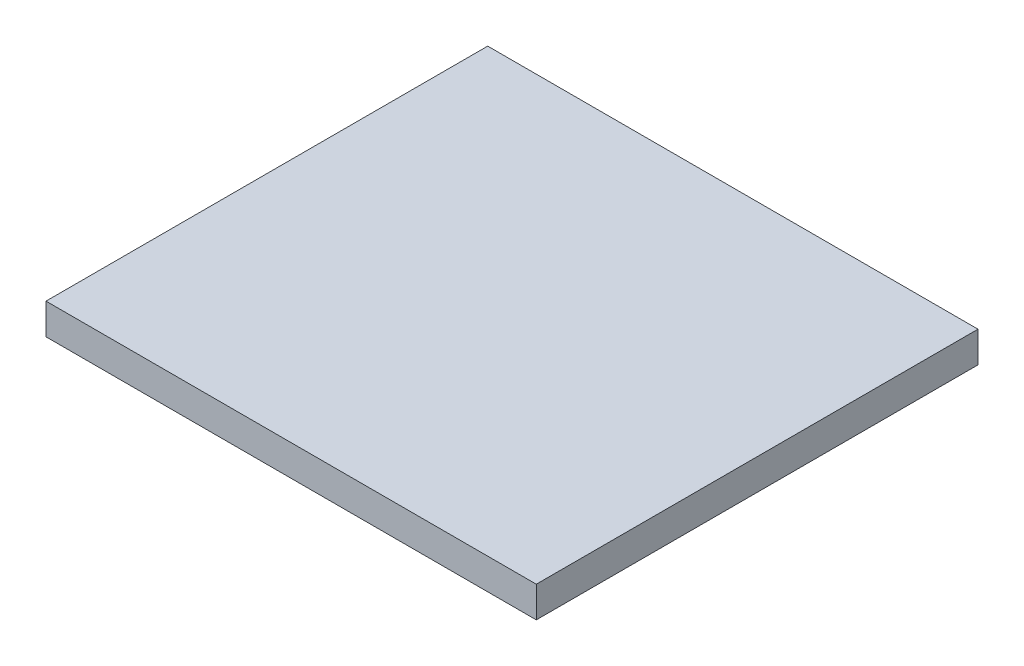
ISO-10303-21;
HEADER;
FILE_DESCRIPTION(('STEP AP214'),'2;1');
FILE_NAME('part.step','',(''),(''),'','','');
FILE_SCHEMA(('AUTOMOTIVE_DESIGN { 1 0 10303 214 1 1 1 1 }'));
ENDSEC;
DATA;
#1=APPLICATION_CONTEXT('core data for automotive mechanical design processes');
#2=APPLICATION_PROTOCOL_DEFINITION('international standard','automotive_design',2000,#1);
#3=PRODUCT_CONTEXT('',#1,'mechanical');
#4=PRODUCT('Part','Part','',(#3));
#5=PRODUCT_RELATED_PRODUCT_CATEGORY('part','',(#4));
#6=PRODUCT_DEFINITION_FORMATION('','',#4);
#7=PRODUCT_DEFINITION_CONTEXT('part definition',#1,'design');
#8=PRODUCT_DEFINITION('design','',#6,#7);
#9=PRODUCT_DEFINITION_SHAPE('','',#8);
#10=(LENGTH_UNIT() NAMED_UNIT(*) SI_UNIT(.MILLI.,.METRE.));
#11=(NAMED_UNIT(*) PLANE_ANGLE_UNIT() SI_UNIT($,.RADIAN.));
#12=(NAMED_UNIT(*) SI_UNIT($,.STERADIAN.) SOLID_ANGLE_UNIT());
#13=UNCERTAINTY_MEASURE_WITH_UNIT(LENGTH_MEASURE(1.E-05),#10,'distance_accuracy_value','');
#14=(GEOMETRIC_REPRESENTATION_CONTEXT(3) GLOBAL_UNCERTAINTY_ASSIGNED_CONTEXT((#13)) GLOBAL_UNIT_ASSIGNED_CONTEXT((#10,
#11,#12)) REPRESENTATION_CONTEXT('',''));
#15=CARTESIAN_POINT('',(0.,0.,0.));
#16=DIRECTION('',(0.,0.,1.));
#17=DIRECTION('',(1.,0.,0.));
#18=AXIS2_PLACEMENT_3D('',#15,#16,#17);
#19=CARTESIAN_POINT('',(-80.9756097560976,7.,-49.0243902439025));
#20=DIRECTION('',(1.,0.,0.));
#21=DIRECTION('',(0.,0.,-1.));
#22=AXIS2_PLACEMENT_3D('',#19,#20,#21);
#23=PLANE('',#22);
#24=DIRECTION('',(0.,0.,1.));
#25=VECTOR('',#24,1.);
#26=CARTESIAN_POINT('',(-80.9756097560976,0.,-49.0243902439025));
#27=LINE('',#26,#25);
#28=CARTESIAN_POINT('',(-80.9756097560976,0.,-49.0243902439025));
#29=VERTEX_POINT('',#28);
#30=CARTESIAN_POINT('',(-80.9756097560976,0.,50.9756097560975));
#31=VERTEX_POINT('',#30);
#32=EDGE_CURVE('E96',#29,#31,#27,.T.);
#33=ORIENTED_EDGE('',*,*,#32,.T.);
#34=DIRECTION('',(0.,-1.,0.));
#35=VECTOR('',#34,1.);
#36=CARTESIAN_POINT('',(-80.9756097560976,7.,50.9756097560975));
#37=LINE('',#36,#35);
#38=CARTESIAN_POINT('',(-80.9756097560976,7.,50.9756097560975));
#39=VERTEX_POINT('',#38);
#40=EDGE_CURVE('E11',#39,#31,#37,.T.);
#41=ORIENTED_EDGE('',*,*,#40,.F.);
#42=DIRECTION('',(0.,0.,1.));
#43=VECTOR('',#42,1.);
#44=CARTESIAN_POINT('',(-80.9756097560976,7.,-49.0243902439025));
#45=LINE('',#44,#43);
#46=CARTESIAN_POINT('',(-80.9756097560976,7.,-49.0243902439025));
#47=VERTEX_POINT('',#46);
#48=EDGE_CURVE('E84',#47,#39,#45,.T.);
#49=ORIENTED_EDGE('',*,*,#48,.F.);
#50=DIRECTION('',(0.,-1.,0.));
#51=VECTOR('',#50,1.);
#52=CARTESIAN_POINT('',(-80.9756097560976,7.,-49.0243902439025));
#53=LINE('',#52,#51);
#54=EDGE_CURVE('E92',#47,#29,#53,.T.);
#55=ORIENTED_EDGE('',*,*,#54,.T.);
#56=EDGE_LOOP('',(#33,#41,#49,#55));
#57=FACE_BOUND('',#56,.T.);
#58=ADVANCED_FACE('F33',(#57),#23,.F.);
#59=CARTESIAN_POINT('',(-80.9756097560976,7.,50.9756097560975));
#60=DIRECTION('',(0.,0.,-1.));
#61=DIRECTION('',(-1.,0.,0.));
#62=AXIS2_PLACEMENT_3D('',#59,#60,#61);
#63=PLANE('',#62);
#64=DIRECTION('',(1.,0.,0.));
#65=VECTOR('',#64,1.);
#66=CARTESIAN_POINT('',(-80.9756097560976,0.,50.9756097560975));
#67=LINE('',#66,#65);
#68=CARTESIAN_POINT('',(30.0243902439024,0.,50.9756097560975));
#69=VERTEX_POINT('',#68);
#70=EDGE_CURVE('E88',#31,#69,#67,.T.);
#71=ORIENTED_EDGE('',*,*,#70,.T.);
#72=DIRECTION('',(0.,-1.,0.));
#73=VECTOR('',#72,1.);
#74=CARTESIAN_POINT('',(30.0243902439024,7.,50.9756097560975));
#75=LINE('',#74,#73);
#76=CARTESIAN_POINT('',(30.0243902439024,7.,50.9756097560975));
#77=VERTEX_POINT('',#76);
#78=EDGE_CURVE('E41',#77,#69,#75,.T.);
#79=ORIENTED_EDGE('',*,*,#78,.F.);
#80=DIRECTION('',(1.,0.,0.));
#81=VECTOR('',#80,1.);
#82=CARTESIAN_POINT('',(-80.9756097560976,7.,50.9756097560975));
#83=LINE('',#82,#81);
#84=EDGE_CURVE('E79',#39,#77,#83,.T.);
#85=ORIENTED_EDGE('',*,*,#84,.F.);
#86=ORIENTED_EDGE('',*,*,#40,.T.);
#87=EDGE_LOOP('',(#71,#79,#85,#86));
#88=FACE_BOUND('',#87,.T.);
#89=ADVANCED_FACE('F87',(#88),#63,.F.);
#90=CARTESIAN_POINT('',(30.0243902439024,7.,-49.0243902439025));
#91=DIRECTION('',(-1.,0.,0.));
#92=DIRECTION('',(0.,0.,1.));
#93=AXIS2_PLACEMENT_3D('',#90,#91,#92);
#94=PLANE('',#93);
#95=DIRECTION('',(0.,0.,-1.));
#96=VECTOR('',#95,1.);
#97=CARTESIAN_POINT('',(30.0243902439024,0.,-49.0243902439025));
#98=LINE('',#97,#96);
#99=CARTESIAN_POINT('',(30.0243902439024,0.,-49.0243902439025));
#100=VERTEX_POINT('',#99);
#101=EDGE_CURVE('E66',#69,#100,#98,.T.);
#102=ORIENTED_EDGE('',*,*,#101,.T.);
#103=DIRECTION('',(0.,-1.,0.));
#104=VECTOR('',#103,1.);
#105=CARTESIAN_POINT('',(30.0243902439024,7.,-49.0243902439025));
#106=LINE('',#105,#104);
#107=CARTESIAN_POINT('',(30.0243902439024,7.,-49.0243902439025));
#108=VERTEX_POINT('',#107);
#109=EDGE_CURVE('E89',#108,#100,#106,.T.);
#110=ORIENTED_EDGE('',*,*,#109,.F.);
#111=DIRECTION('',(0.,0.,-1.));
#112=VECTOR('',#111,1.);
#113=CARTESIAN_POINT('',(30.0243902439024,7.,-49.0243902439025));
#114=LINE('',#113,#112);
#115=EDGE_CURVE('E82',#77,#108,#114,.T.);
#116=ORIENTED_EDGE('',*,*,#115,.F.);
#117=ORIENTED_EDGE('',*,*,#78,.T.);
#118=EDGE_LOOP('',(#102,#110,#116,#117));
#119=FACE_BOUND('',#118,.T.);
#120=ADVANCED_FACE('F90',(#119),#94,.F.);
#121=CARTESIAN_POINT('',(-80.9756097560976,7.,-49.0243902439025));
#122=DIRECTION('',(0.,0.,1.));
#123=DIRECTION('',(1.,0.,0.));
#124=AXIS2_PLACEMENT_3D('',#121,#122,#123);
#125=PLANE('',#124);
#126=DIRECTION('',(-1.,0.,0.));
#127=VECTOR('',#126,1.);
#128=CARTESIAN_POINT('',(-80.9756097560976,0.,-49.0243902439025));
#129=LINE('',#128,#127);
#130=EDGE_CURVE('E72',#100,#29,#129,.T.);
#131=ORIENTED_EDGE('',*,*,#130,.T.);
#132=ORIENTED_EDGE('',*,*,#54,.F.);
#133=DIRECTION('',(-1.,0.,0.));
#134=VECTOR('',#133,1.);
#135=CARTESIAN_POINT('',(-80.9756097560976,7.,-49.0243902439025));
#136=LINE('',#135,#134);
#137=EDGE_CURVE('E49',#108,#47,#136,.T.);
#138=ORIENTED_EDGE('',*,*,#137,.F.);
#139=ORIENTED_EDGE('',*,*,#109,.T.);
#140=EDGE_LOOP('',(#131,#132,#138,#139));
#141=FACE_BOUND('',#140,.T.);
#142=ADVANCED_FACE('F103',(#141),#125,.F.);
#143=CARTESIAN_POINT('',(0.,7.,0.));
#144=DIRECTION('',(0.,1.,0.));
#145=DIRECTION('',(0.,0.,1.));
#146=AXIS2_PLACEMENT_3D('',#143,#144,#145);
#147=PLANE('',#146);
#148=ORIENTED_EDGE('',*,*,#48,.T.);
#149=ORIENTED_EDGE('',*,*,#84,.T.);
#150=ORIENTED_EDGE('',*,*,#115,.T.);
#151=ORIENTED_EDGE('',*,*,#137,.T.);
#152=EDGE_LOOP('',(#148,#149,#150,#151));
#153=FACE_BOUND('',#152,.T.);
#154=ADVANCED_FACE('F80',(#153),#147,.T.);
#155=CARTESIAN_POINT('',(0.,0.,0.));
#156=DIRECTION('',(0.,1.,0.));
#157=DIRECTION('',(0.,0.,1.));
#158=AXIS2_PLACEMENT_3D('',#155,#156,#157);
#159=PLANE('',#158);
#160=ORIENTED_EDGE('',*,*,#32,.F.);
#161=ORIENTED_EDGE('',*,*,#130,.F.);
#162=ORIENTED_EDGE('',*,*,#101,.F.);
#163=ORIENTED_EDGE('',*,*,#70,.F.);
#164=EDGE_LOOP('',(#160,#161,#162,#163));
#165=FACE_BOUND('',#164,.T.);
#166=ADVANCED_FACE('F106',(#165),#159,.F.);
#167=CLOSED_SHELL('',(#58,#89,#120,#142,#154,#166));
#168=MANIFOLD_SOLID_BREP('B2',#167);
#169=ADVANCED_BREP_SHAPE_REPRESENTATION('',(#18,#168),#14);
#170=SHAPE_DEFINITION_REPRESENTATION(#9,#169);
ENDSEC;
END-ISO-10303-21;
